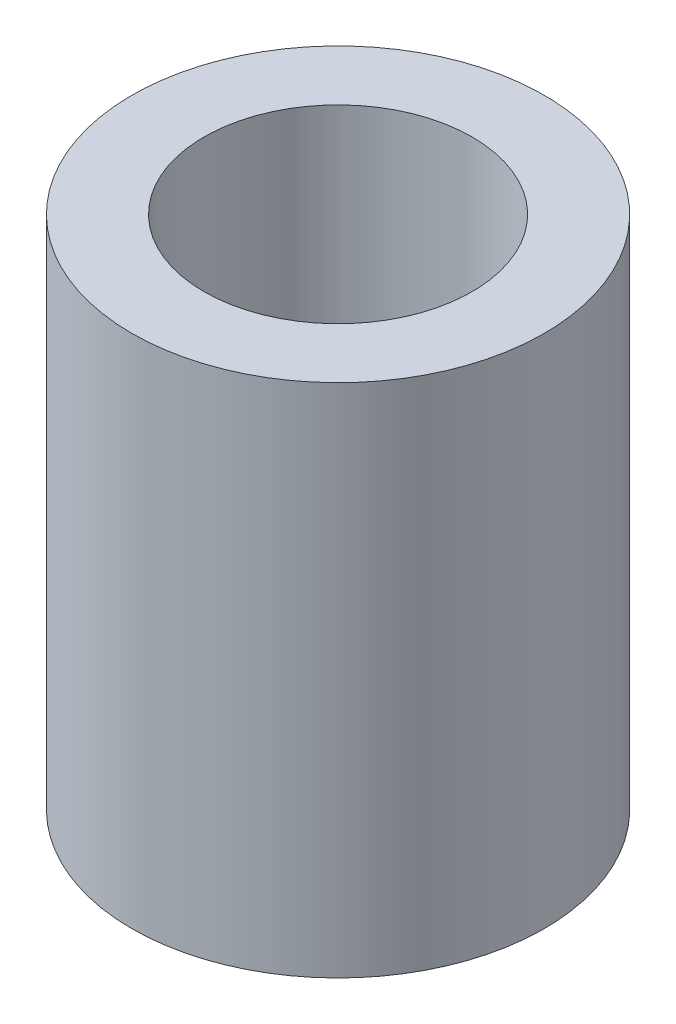
ISO-10303-21;
HEADER;
FILE_DESCRIPTION(('STEP AP214'),'2;1');
FILE_NAME('part.step','',(''),(''),'','','');
FILE_SCHEMA(('AUTOMOTIVE_DESIGN { 1 0 10303 214 1 1 1 1 }'));
ENDSEC;
DATA;
#1=APPLICATION_CONTEXT('core data for automotive mechanical design processes');
#2=APPLICATION_PROTOCOL_DEFINITION('international standard','automotive_design',2000,#1);
#3=PRODUCT_CONTEXT('',#1,'mechanical');
#4=PRODUCT('Part','Part','',(#3));
#5=PRODUCT_RELATED_PRODUCT_CATEGORY('part','',(#4));
#6=PRODUCT_DEFINITION_FORMATION('','',#4);
#7=PRODUCT_DEFINITION_CONTEXT('part definition',#1,'design');
#8=PRODUCT_DEFINITION('design','',#6,#7);
#9=PRODUCT_DEFINITION_SHAPE('','',#8);
#10=(LENGTH_UNIT() NAMED_UNIT(*) SI_UNIT(.MILLI.,.METRE.));
#11=(NAMED_UNIT(*) PLANE_ANGLE_UNIT() SI_UNIT($,.RADIAN.));
#12=(NAMED_UNIT(*) SI_UNIT($,.STERADIAN.) SOLID_ANGLE_UNIT());
#13=UNCERTAINTY_MEASURE_WITH_UNIT(LENGTH_MEASURE(1.E-05),#10,'distance_accuracy_value','');
#14=(GEOMETRIC_REPRESENTATION_CONTEXT(3) GLOBAL_UNCERTAINTY_ASSIGNED_CONTEXT((#13)) GLOBAL_UNIT_ASSIGNED_CONTEXT((#10,
#11,#12)) REPRESENTATION_CONTEXT('',''));
#15=CARTESIAN_POINT('',(0.,0.,0.));
#16=DIRECTION('',(0.,0.,1.));
#17=DIRECTION('',(1.,0.,0.));
#18=AXIS2_PLACEMENT_3D('',#15,#16,#17);
#19=CARTESIAN_POINT('',(0.,10.,0.));
#20=DIRECTION('',(0.,1.,0.));
#21=DIRECTION('',(0.,0.,1.));
#22=AXIS2_PLACEMENT_3D('',#19,#20,#21);
#23=PLANE('',#22);
#24=CARTESIAN_POINT('',(0.,10.,0.));
#25=DIRECTION('',(0.,1.,0.));
#26=DIRECTION('',(0.,0.,1.));
#27=AXIS2_PLACEMENT_3D('',#24,#25,#26);
#28=CIRCLE('',#27,4.);
#29=CARTESIAN_POINT('',(0.,10.,4.));
#30=VERTEX_POINT('',#29);
#31=EDGE_CURVE('E10',#30,#30,#28,.T.);
#32=ORIENTED_EDGE('',*,*,#31,.T.);
#33=EDGE_LOOP('',(#32));
#34=FACE_BOUND('',#33,.T.);
#35=CARTESIAN_POINT('',(0.,10.,0.));
#36=DIRECTION('',(0.,1.,0.));
#37=DIRECTION('',(0.,0.,1.));
#38=AXIS2_PLACEMENT_3D('',#35,#36,#37);
#39=CIRCLE('',#38,2.6);
#40=CARTESIAN_POINT('',(0.,10.,2.6));
#41=VERTEX_POINT('',#40);
#42=EDGE_CURVE('E44',#41,#41,#39,.T.);
#43=ORIENTED_EDGE('',*,*,#42,.F.);
#44=EDGE_LOOP('',(#43));
#45=FACE_BOUND('',#44,.T.);
#46=ADVANCED_FACE('F33',(#34,#45),#23,.T.);
#47=CARTESIAN_POINT('',(0.,0.,0.));
#48=DIRECTION('',(0.,1.,0.));
#49=DIRECTION('',(0.,0.,1.));
#50=AXIS2_PLACEMENT_3D('',#47,#48,#49);
#51=PLANE('',#50);
#52=CARTESIAN_POINT('',(0.,0.,0.));
#53=DIRECTION('',(0.,1.,0.));
#54=DIRECTION('',(0.,0.,1.));
#55=AXIS2_PLACEMENT_3D('',#52,#53,#54);
#56=CIRCLE('',#55,4.);
#57=CARTESIAN_POINT('',(0.,0.,4.));
#58=VERTEX_POINT('',#57);
#59=EDGE_CURVE('E37',#58,#58,#56,.T.);
#60=ORIENTED_EDGE('',*,*,#59,.F.);
#61=EDGE_LOOP('',(#60));
#62=FACE_BOUND('',#61,.T.);
#63=CARTESIAN_POINT('',(0.,0.,0.));
#64=DIRECTION('',(0.,1.,0.));
#65=DIRECTION('',(0.,0.,1.));
#66=AXIS2_PLACEMENT_3D('',#63,#64,#65);
#67=CIRCLE('',#66,2.6);
#68=CARTESIAN_POINT('',(0.,0.,2.6));
#69=VERTEX_POINT('',#68);
#70=EDGE_CURVE('E46',#69,#69,#67,.T.);
#71=ORIENTED_EDGE('',*,*,#70,.T.);
#72=EDGE_LOOP('',(#71));
#73=FACE_BOUND('',#72,.T.);
#74=ADVANCED_FACE('F56',(#62,#73),#51,.F.);
#75=CARTESIAN_POINT('',(0.,10.,0.));
#76=DIRECTION('',(0.,-1.,0.));
#77=DIRECTION('',(0.,0.,-1.));
#78=AXIS2_PLACEMENT_3D('',#75,#76,#77);
#79=CYLINDRICAL_SURFACE('',#78,4.);
#80=ORIENTED_EDGE('',*,*,#31,.F.);
#81=EDGE_LOOP('',(#80));
#82=FACE_BOUND('',#81,.T.);
#83=ORIENTED_EDGE('',*,*,#59,.T.);
#84=EDGE_LOOP('',(#83));
#85=FACE_BOUND('',#84,.T.);
#86=ADVANCED_FACE('F35',(#82,#85),#79,.T.);
#87=CARTESIAN_POINT('',(0.,10.,0.));
#88=DIRECTION('',(0.,-1.,0.));
#89=DIRECTION('',(0.,0.,-1.));
#90=AXIS2_PLACEMENT_3D('',#87,#88,#89);
#91=CYLINDRICAL_SURFACE('',#90,2.6);
#92=ORIENTED_EDGE('',*,*,#42,.T.);
#93=EDGE_LOOP('',(#92));
#94=FACE_BOUND('',#93,.T.);
#95=ORIENTED_EDGE('',*,*,#70,.F.);
#96=EDGE_LOOP('',(#95));
#97=FACE_BOUND('',#96,.T.);
#98=ADVANCED_FACE('F52',(#94,#97),#91,.F.);
#99=CLOSED_SHELL('',(#46,#74,#86,#98));
#100=MANIFOLD_SOLID_BREP('B2',#99);
#101=ADVANCED_BREP_SHAPE_REPRESENTATION('',(#18,#100),#14);
#102=SHAPE_DEFINITION_REPRESENTATION(#9,#101);
ENDSEC;
END-ISO-10303-21;
